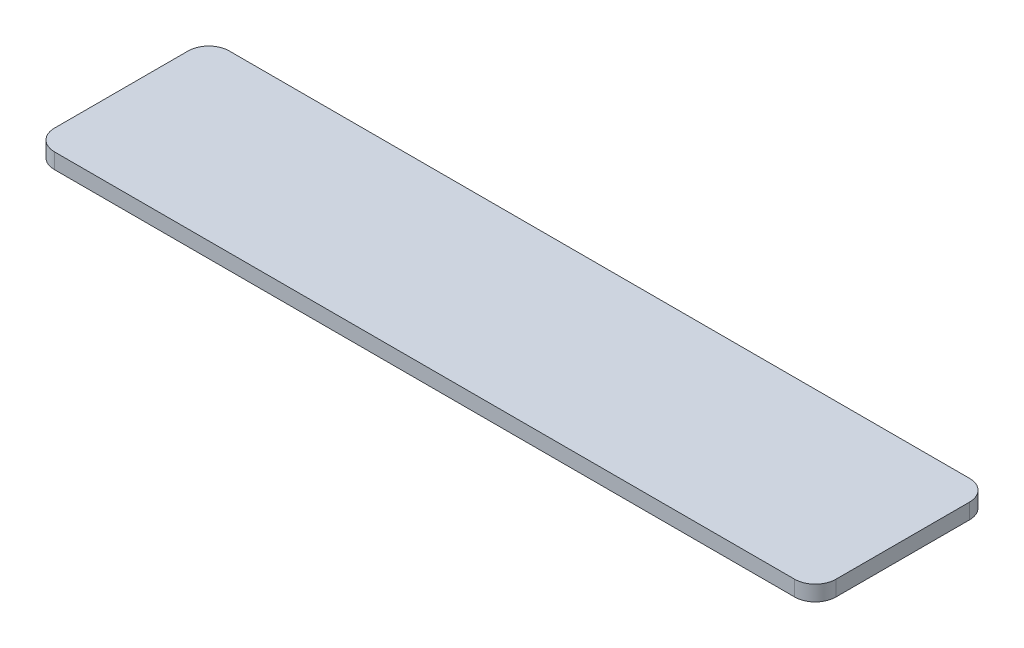
ISO-10303-21;
HEADER;
FILE_DESCRIPTION(('STEP AP214'),'2;1');
FILE_NAME('part.step','',(''),(''),'','','');
FILE_SCHEMA(('AUTOMOTIVE_DESIGN { 1 0 10303 214 1 1 1 1 }'));
ENDSEC;
DATA;
#1=APPLICATION_CONTEXT('core data for automotive mechanical design processes');
#2=APPLICATION_PROTOCOL_DEFINITION('international standard','automotive_design',2000,#1);
#3=PRODUCT_CONTEXT('',#1,'mechanical');
#4=PRODUCT('Part','Part','',(#3));
#5=PRODUCT_RELATED_PRODUCT_CATEGORY('part','',(#4));
#6=PRODUCT_DEFINITION_FORMATION('','',#4);
#7=PRODUCT_DEFINITION_CONTEXT('part definition',#1,'design');
#8=PRODUCT_DEFINITION('design','',#6,#7);
#9=PRODUCT_DEFINITION_SHAPE('','',#8);
#10=(LENGTH_UNIT() NAMED_UNIT(*) SI_UNIT(.MILLI.,.METRE.));
#11=(NAMED_UNIT(*) PLANE_ANGLE_UNIT() SI_UNIT($,.RADIAN.));
#12=(NAMED_UNIT(*) SI_UNIT($,.STERADIAN.) SOLID_ANGLE_UNIT());
#13=UNCERTAINTY_MEASURE_WITH_UNIT(LENGTH_MEASURE(1.E-05),#10,'distance_accuracy_value','');
#14=(GEOMETRIC_REPRESENTATION_CONTEXT(3) GLOBAL_UNCERTAINTY_ASSIGNED_CONTEXT((#13)) GLOBAL_UNIT_ASSIGNED_CONTEXT((#10,
#11,#12)) REPRESENTATION_CONTEXT('',''));
#15=CARTESIAN_POINT('',(0.,0.,0.));
#16=DIRECTION('',(0.,0.,1.));
#17=DIRECTION('',(1.,0.,0.));
#18=AXIS2_PLACEMENT_3D('',#15,#16,#17);
#19=CARTESIAN_POINT('',(241.3,-9.525,53.975));
#20=DIRECTION('',(1.,0.,0.));
#21=DIRECTION('',(0.,0.,-1.));
#22=AXIS2_PLACEMENT_3D('',#19,#20,#21);
#23=PLANE('',#22);
#24=DIRECTION('',(0.,0.,-1.));
#25=VECTOR('',#24,1.);
#26=CARTESIAN_POINT('',(241.3,-9.525,53.975));
#27=LINE('',#26,#25);
#28=CARTESIAN_POINT('',(241.3,-9.525,41.275));
#29=VERTEX_POINT('',#28);
#30=CARTESIAN_POINT('',(241.3,-9.525,-41.275));
#31=VERTEX_POINT('',#30);
#32=EDGE_CURVE('E197',#29,#31,#27,.T.);
#33=ORIENTED_EDGE('',*,*,#32,.T.);
#34=DIRECTION('',(0.,1.,0.));
#35=VECTOR('',#34,1.);
#36=CARTESIAN_POINT('',(241.3,-9.525,-41.275));
#37=LINE('',#36,#35);
#38=CARTESIAN_POINT('',(241.3,0.,-41.275));
#39=VERTEX_POINT('',#38);
#40=EDGE_CURVE('E135',#31,#39,#37,.T.);
#41=ORIENTED_EDGE('',*,*,#40,.T.);
#42=DIRECTION('',(0.,0.,-1.));
#43=VECTOR('',#42,1.);
#44=CARTESIAN_POINT('',(241.3,0.,53.975));
#45=LINE('',#44,#43);
#46=CARTESIAN_POINT('',(241.3,0.,41.275));
#47=VERTEX_POINT('',#46);
#48=EDGE_CURVE('E126',#47,#39,#45,.T.);
#49=ORIENTED_EDGE('',*,*,#48,.F.);
#50=DIRECTION('',(0.,1.,0.));
#51=VECTOR('',#50,1.);
#52=CARTESIAN_POINT('',(241.3,-9.525,41.275));
#53=LINE('',#52,#51);
#54=EDGE_CURVE('E140',#47,#29,#53,.F.);
#55=ORIENTED_EDGE('',*,*,#54,.T.);
#56=EDGE_LOOP('',(#33,#41,#49,#55));
#57=FACE_BOUND('',#56,.T.);
#58=ADVANCED_FACE('F49',(#57),#23,.T.);
#59=CARTESIAN_POINT('',(-241.3,-9.525,53.975));
#60=DIRECTION('',(0.,0.,1.));
#61=DIRECTION('',(1.,0.,0.));
#62=AXIS2_PLACEMENT_3D('',#59,#60,#61);
#63=PLANE('',#62);
#64=DIRECTION('',(1.,0.,0.));
#65=VECTOR('',#64,1.);
#66=CARTESIAN_POINT('',(-241.3,0.,53.975));
#67=LINE('',#66,#65);
#68=CARTESIAN_POINT('',(-228.6,0.,53.975));
#69=VERTEX_POINT('',#68);
#70=CARTESIAN_POINT('',(228.6,0.,53.975));
#71=VERTEX_POINT('',#70);
#72=EDGE_CURVE('E128',#69,#71,#67,.T.);
#73=ORIENTED_EDGE('',*,*,#72,.F.);
#74=DIRECTION('',(0.,1.,0.));
#75=VECTOR('',#74,1.);
#76=CARTESIAN_POINT('',(-228.6,-9.525,53.975));
#77=LINE('',#76,#75);
#78=CARTESIAN_POINT('',(-228.6,-9.525,53.975));
#79=VERTEX_POINT('',#78);
#80=EDGE_CURVE('E11',#69,#79,#77,.F.);
#81=ORIENTED_EDGE('',*,*,#80,.T.);
#82=DIRECTION('',(1.,0.,0.));
#83=VECTOR('',#82,1.);
#84=CARTESIAN_POINT('',(-241.3,-9.525,53.975));
#85=LINE('',#84,#83);
#86=CARTESIAN_POINT('',(228.6,-9.525,53.975));
#87=VERTEX_POINT('',#86);
#88=EDGE_CURVE('E149',#79,#87,#85,.T.);
#89=ORIENTED_EDGE('',*,*,#88,.T.);
#90=DIRECTION('',(0.,1.,0.));
#91=VECTOR('',#90,1.);
#92=CARTESIAN_POINT('',(228.6,-9.525,53.975));
#93=LINE('',#92,#91);
#94=EDGE_CURVE('E57',#87,#71,#93,.T.);
#95=ORIENTED_EDGE('',*,*,#94,.T.);
#96=EDGE_LOOP('',(#73,#81,#89,#95));
#97=FACE_BOUND('',#96,.T.);
#98=ADVANCED_FACE('F185',(#97),#63,.T.);
#99=CARTESIAN_POINT('',(-241.3,-9.525,53.975));
#100=DIRECTION('',(-1.,0.,0.));
#101=DIRECTION('',(0.,0.,1.));
#102=AXIS2_PLACEMENT_3D('',#99,#100,#101);
#103=PLANE('',#102);
#104=DIRECTION('',(0.,0.,1.));
#105=VECTOR('',#104,1.);
#106=CARTESIAN_POINT('',(-241.3,0.,53.975));
#107=LINE('',#106,#105);
#108=CARTESIAN_POINT('',(-241.3,0.,-41.275));
#109=VERTEX_POINT('',#108);
#110=CARTESIAN_POINT('',(-241.3,0.,41.275));
#111=VERTEX_POINT('',#110);
#112=EDGE_CURVE('E194',#109,#111,#107,.T.);
#113=ORIENTED_EDGE('',*,*,#112,.F.);
#114=DIRECTION('',(0.,1.,0.));
#115=VECTOR('',#114,1.);
#116=CARTESIAN_POINT('',(-241.3,-9.525,-41.275));
#117=LINE('',#116,#115);
#118=CARTESIAN_POINT('',(-241.3,-9.525,-41.275));
#119=VERTEX_POINT('',#118);
#120=EDGE_CURVE('E71',#109,#119,#117,.F.);
#121=ORIENTED_EDGE('',*,*,#120,.T.);
#122=DIRECTION('',(0.,0.,1.));
#123=VECTOR('',#122,1.);
#124=CARTESIAN_POINT('',(-241.3,-9.525,53.975));
#125=LINE('',#124,#123);
#126=CARTESIAN_POINT('',(-241.3,-9.525,41.275));
#127=VERTEX_POINT('',#126);
#128=EDGE_CURVE('E157',#119,#127,#125,.T.);
#129=ORIENTED_EDGE('',*,*,#128,.T.);
#130=DIRECTION('',(0.,1.,0.));
#131=VECTOR('',#130,1.);
#132=CARTESIAN_POINT('',(-241.3,-9.525,41.275));
#133=LINE('',#132,#131);
#134=EDGE_CURVE('E180',#127,#111,#133,.T.);
#135=ORIENTED_EDGE('',*,*,#134,.T.);
#136=EDGE_LOOP('',(#113,#121,#129,#135));
#137=FACE_BOUND('',#136,.T.);
#138=ADVANCED_FACE('F193',(#137),#103,.T.);
#139=CARTESIAN_POINT('',(-241.3,-9.525,-53.975));
#140=DIRECTION('',(0.,0.,-1.));
#141=DIRECTION('',(-1.,0.,0.));
#142=AXIS2_PLACEMENT_3D('',#139,#140,#141);
#143=PLANE('',#142);
#144=DIRECTION('',(-1.,0.,0.));
#145=VECTOR('',#144,1.);
#146=CARTESIAN_POINT('',(-241.3,0.,-53.975));
#147=LINE('',#146,#145);
#148=CARTESIAN_POINT('',(228.6,0.,-53.975));
#149=VERTEX_POINT('',#148);
#150=CARTESIAN_POINT('',(-228.6,0.,-53.975));
#151=VERTEX_POINT('',#150);
#152=EDGE_CURVE('E144',#149,#151,#147,.T.);
#153=ORIENTED_EDGE('',*,*,#152,.F.);
#154=DIRECTION('',(0.,1.,0.));
#155=VECTOR('',#154,1.);
#156=CARTESIAN_POINT('',(228.6,-9.525,-53.975));
#157=LINE('',#156,#155);
#158=CARTESIAN_POINT('',(228.6,-9.525,-53.975));
#159=VERTEX_POINT('',#158);
#160=EDGE_CURVE('E171',#149,#159,#157,.F.);
#161=ORIENTED_EDGE('',*,*,#160,.T.);
#162=DIRECTION('',(-1.,0.,0.));
#163=VECTOR('',#162,1.);
#164=CARTESIAN_POINT('',(-241.3,-9.525,-53.975));
#165=LINE('',#164,#163);
#166=CARTESIAN_POINT('',(-228.6,-9.525,-53.975));
#167=VERTEX_POINT('',#166);
#168=EDGE_CURVE('E202',#159,#167,#165,.T.);
#169=ORIENTED_EDGE('',*,*,#168,.T.);
#170=DIRECTION('',(0.,1.,0.));
#171=VECTOR('',#170,1.);
#172=CARTESIAN_POINT('',(-228.6,-9.525,-53.975));
#173=LINE('',#172,#171);
#174=EDGE_CURVE('E168',#167,#151,#173,.T.);
#175=ORIENTED_EDGE('',*,*,#174,.T.);
#176=EDGE_LOOP('',(#153,#161,#169,#175));
#177=FACE_BOUND('',#176,.T.);
#178=ADVANCED_FACE('F213',(#177),#143,.T.);
#179=CARTESIAN_POINT('',(0.,-9.525,0.));
#180=DIRECTION('',(0.,-1.,0.));
#181=DIRECTION('',(0.,0.,-1.));
#182=AXIS2_PLACEMENT_3D('',#179,#180,#181);
#183=PLANE('',#182);
#184=ORIENTED_EDGE('',*,*,#168,.F.);
#185=CARTESIAN_POINT('',(228.6,-9.525,-41.275));
#186=DIRECTION('',(0.,-1.,0.));
#187=DIRECTION('',(0.,0.,-1.));
#188=AXIS2_PLACEMENT_3D('',#185,#186,#187);
#189=CIRCLE('',#188,12.7);
#190=EDGE_CURVE('E178',#159,#31,#189,.T.);
#191=ORIENTED_EDGE('',*,*,#190,.T.);
#192=ORIENTED_EDGE('',*,*,#32,.F.);
#193=CARTESIAN_POINT('',(228.6,-9.525,41.275));
#194=DIRECTION('',(0.,-1.,0.));
#195=DIRECTION('',(0.,0.,-1.));
#196=AXIS2_PLACEMENT_3D('',#193,#194,#195);
#197=CIRCLE('',#196,12.7);
#198=EDGE_CURVE('E147',#29,#87,#197,.T.);
#199=ORIENTED_EDGE('',*,*,#198,.T.);
#200=ORIENTED_EDGE('',*,*,#88,.F.);
#201=CARTESIAN_POINT('',(-228.6,-9.525,41.275));
#202=DIRECTION('',(0.,-1.,0.));
#203=DIRECTION('',(0.,0.,-1.));
#204=AXIS2_PLACEMENT_3D('',#201,#202,#203);
#205=CIRCLE('',#204,12.7);
#206=EDGE_CURVE('E64',#79,#127,#205,.T.);
#207=ORIENTED_EDGE('',*,*,#206,.T.);
#208=ORIENTED_EDGE('',*,*,#128,.F.);
#209=CARTESIAN_POINT('',(-228.6,-9.525,-41.275));
#210=DIRECTION('',(0.,-1.,0.));
#211=DIRECTION('',(0.,0.,-1.));
#212=AXIS2_PLACEMENT_3D('',#209,#210,#211);
#213=CIRCLE('',#212,12.7);
#214=EDGE_CURVE('E176',#119,#167,#213,.T.);
#215=ORIENTED_EDGE('',*,*,#214,.T.);
#216=EDGE_LOOP('',(#184,#191,#192,#199,#200,#207,#208,#215));
#217=FACE_BOUND('',#216,.T.);
#218=ADVANCED_FACE('F188',(#217),#183,.T.);
#219=CARTESIAN_POINT('',(0.,0.,0.));
#220=DIRECTION('',(0.,-1.,0.));
#221=DIRECTION('',(0.,0.,-1.));
#222=AXIS2_PLACEMENT_3D('',#219,#220,#221);
#223=PLANE('',#222);
#224=ORIENTED_EDGE('',*,*,#48,.T.);
#225=CARTESIAN_POINT('',(228.6,0.,-41.275));
#226=DIRECTION('',(0.,-1.,0.));
#227=DIRECTION('',(0.,0.,-1.));
#228=AXIS2_PLACEMENT_3D('',#225,#226,#227);
#229=CIRCLE('',#228,12.7);
#230=EDGE_CURVE('E165',#39,#149,#229,.F.);
#231=ORIENTED_EDGE('',*,*,#230,.T.);
#232=ORIENTED_EDGE('',*,*,#152,.T.);
#233=CARTESIAN_POINT('',(-228.6,0.,-41.275));
#234=DIRECTION('',(0.,-1.,0.));
#235=DIRECTION('',(0.,0.,-1.));
#236=AXIS2_PLACEMENT_3D('',#233,#234,#235);
#237=CIRCLE('',#236,12.7);
#238=EDGE_CURVE('E163',#151,#109,#237,.F.);
#239=ORIENTED_EDGE('',*,*,#238,.T.);
#240=ORIENTED_EDGE('',*,*,#112,.T.);
#241=CARTESIAN_POINT('',(-228.6,0.,41.275));
#242=DIRECTION('',(0.,-1.,0.));
#243=DIRECTION('',(0.,0.,-1.));
#244=AXIS2_PLACEMENT_3D('',#241,#242,#243);
#245=CIRCLE('',#244,12.7);
#246=EDGE_CURVE('E134',#111,#69,#245,.F.);
#247=ORIENTED_EDGE('',*,*,#246,.T.);
#248=ORIENTED_EDGE('',*,*,#72,.T.);
#249=CARTESIAN_POINT('',(228.6,0.,41.275));
#250=DIRECTION('',(0.,-1.,0.));
#251=DIRECTION('',(0.,0.,-1.));
#252=AXIS2_PLACEMENT_3D('',#249,#250,#251);
#253=CIRCLE('',#252,12.7);
#254=EDGE_CURVE('E123',#71,#47,#253,.F.);
#255=ORIENTED_EDGE('',*,*,#254,.T.);
#256=EDGE_LOOP('',(#224,#231,#232,#239,#240,#247,#248,#255));
#257=FACE_BOUND('',#256,.T.);
#258=ADVANCED_FACE('F125',(#257),#223,.F.);
#259=CARTESIAN_POINT('',(228.6,-9.525,-41.275));
#260=DIRECTION('',(0.,1.,0.));
#261=DIRECTION('',(0.,0.,1.));
#262=AXIS2_PLACEMENT_3D('',#259,#260,#261);
#263=CYLINDRICAL_SURFACE('',#262,12.7);
#264=ORIENTED_EDGE('',*,*,#190,.F.);
#265=ORIENTED_EDGE('',*,*,#160,.F.);
#266=ORIENTED_EDGE('',*,*,#230,.F.);
#267=ORIENTED_EDGE('',*,*,#40,.F.);
#268=EDGE_LOOP('',(#264,#265,#266,#267));
#269=FACE_BOUND('',#268,.T.);
#270=ADVANCED_FACE('F209',(#269),#263,.T.);
#271=CARTESIAN_POINT('',(-228.6,-9.525,-41.275));
#272=DIRECTION('',(0.,1.,0.));
#273=DIRECTION('',(0.,0.,1.));
#274=AXIS2_PLACEMENT_3D('',#271,#272,#273);
#275=CYLINDRICAL_SURFACE('',#274,12.7);
#276=ORIENTED_EDGE('',*,*,#214,.F.);
#277=ORIENTED_EDGE('',*,*,#120,.F.);
#278=ORIENTED_EDGE('',*,*,#238,.F.);
#279=ORIENTED_EDGE('',*,*,#174,.F.);
#280=EDGE_LOOP('',(#276,#277,#278,#279));
#281=FACE_BOUND('',#280,.T.);
#282=ADVANCED_FACE('F217',(#281),#275,.T.);
#283=CARTESIAN_POINT('',(-228.6,-9.525,41.275));
#284=DIRECTION('',(0.,1.,0.));
#285=DIRECTION('',(0.,0.,1.));
#286=AXIS2_PLACEMENT_3D('',#283,#284,#285);
#287=CYLINDRICAL_SURFACE('',#286,12.7);
#288=ORIENTED_EDGE('',*,*,#206,.F.);
#289=ORIENTED_EDGE('',*,*,#80,.F.);
#290=ORIENTED_EDGE('',*,*,#246,.F.);
#291=ORIENTED_EDGE('',*,*,#134,.F.);
#292=EDGE_LOOP('',(#288,#289,#290,#291));
#293=FACE_BOUND('',#292,.T.);
#294=ADVANCED_FACE('F191',(#293),#287,.T.);
#295=CARTESIAN_POINT('',(228.6,-9.525,41.275));
#296=DIRECTION('',(0.,1.,0.));
#297=DIRECTION('',(0.,0.,1.));
#298=AXIS2_PLACEMENT_3D('',#295,#296,#297);
#299=CYLINDRICAL_SURFACE('',#298,12.7);
#300=ORIENTED_EDGE('',*,*,#198,.F.);
#301=ORIENTED_EDGE('',*,*,#54,.F.);
#302=ORIENTED_EDGE('',*,*,#254,.F.);
#303=ORIENTED_EDGE('',*,*,#94,.F.);
#304=EDGE_LOOP('',(#300,#301,#302,#303));
#305=FACE_BOUND('',#304,.T.);
#306=ADVANCED_FACE('F51',(#305),#299,.T.);
#307=CLOSED_SHELL('',(#58,#98,#138,#178,#218,#258,#270,#282,#294,#306));
#308=MANIFOLD_SOLID_BREP('B2',#307);
#309=ADVANCED_BREP_SHAPE_REPRESENTATION('',(#18,#308),#14);
#310=SHAPE_DEFINITION_REPRESENTATION(#9,#309);
ENDSEC;
END-ISO-10303-21;
